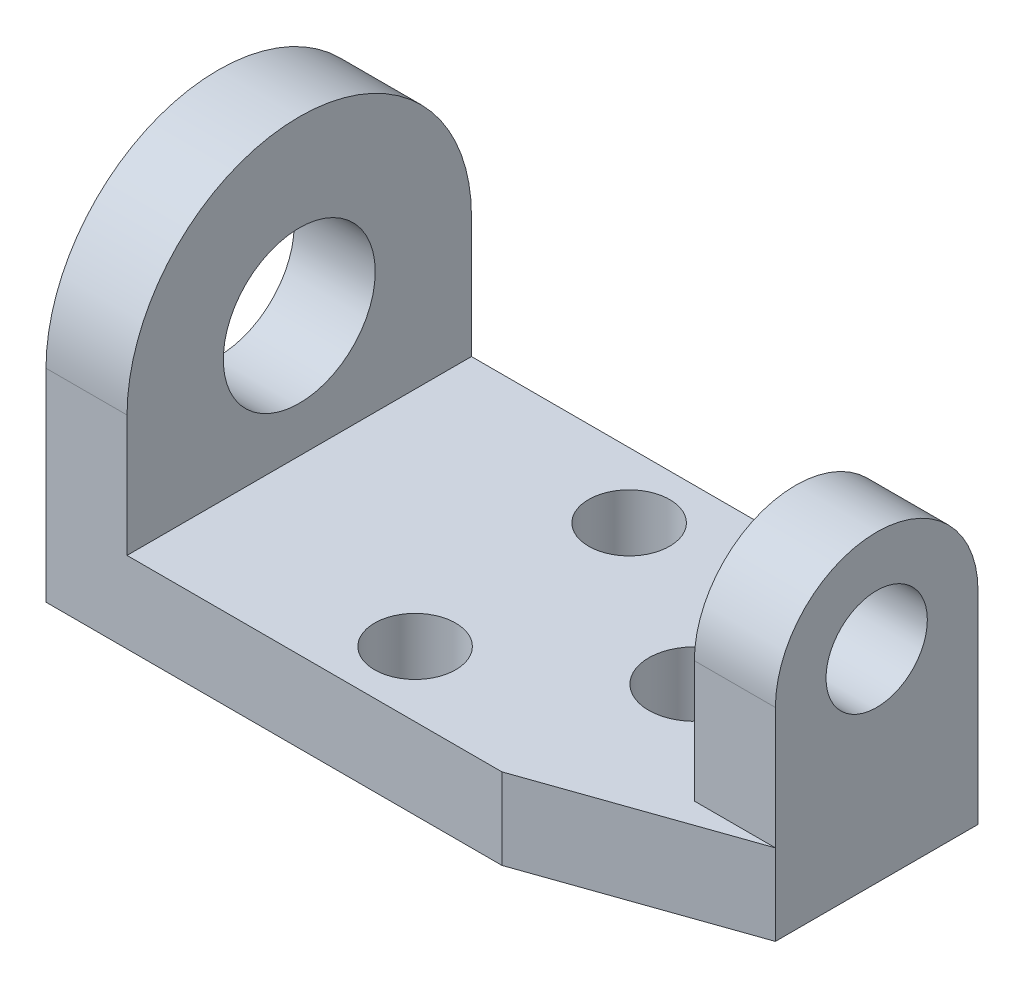
ISO-10303-21;
HEADER;
FILE_DESCRIPTION(('STEP AP214'),'2;1');
FILE_NAME('part.step','',(''),(''),'','','');
FILE_SCHEMA(('AUTOMOTIVE_DESIGN { 1 0 10303 214 1 1 1 1 }'));
ENDSEC;
DATA;
#1=APPLICATION_CONTEXT('core data for automotive mechanical design processes');
#2=APPLICATION_PROTOCOL_DEFINITION('international standard','automotive_design',2000,#1);
#3=PRODUCT_CONTEXT('',#1,'mechanical');
#4=PRODUCT('Part','Part','',(#3));
#5=PRODUCT_RELATED_PRODUCT_CATEGORY('part','',(#4));
#6=PRODUCT_DEFINITION_FORMATION('','',#4);
#7=PRODUCT_DEFINITION_CONTEXT('part definition',#1,'design');
#8=PRODUCT_DEFINITION('design','',#6,#7);
#9=PRODUCT_DEFINITION_SHAPE('','',#8);
#10=(LENGTH_UNIT() NAMED_UNIT(*) SI_UNIT(.MILLI.,.METRE.));
#11=(NAMED_UNIT(*) PLANE_ANGLE_UNIT() SI_UNIT($,.RADIAN.));
#12=(NAMED_UNIT(*) SI_UNIT($,.STERADIAN.) SOLID_ANGLE_UNIT());
#13=UNCERTAINTY_MEASURE_WITH_UNIT(LENGTH_MEASURE(1.E-05),#10,'distance_accuracy_value','');
#14=(GEOMETRIC_REPRESENTATION_CONTEXT(3) GLOBAL_UNCERTAINTY_ASSIGNED_CONTEXT((#13)) GLOBAL_UNIT_ASSIGNED_CONTEXT((#10,
#11,#12)) REPRESENTATION_CONTEXT('',''));
#15=CARTESIAN_POINT('',(0.,0.,0.));
#16=DIRECTION('',(0.,0.,1.));
#17=DIRECTION('',(1.,0.,0.));
#18=AXIS2_PLACEMENT_3D('',#15,#16,#17);
#19=CARTESIAN_POINT('',(0.,8.,0.));
#20=DIRECTION('',(-1.,0.,0.));
#21=DIRECTION('',(0.,0.,1.));
#22=AXIS2_PLACEMENT_3D('',#19,#20,#21);
#23=PLANE('',#22);
#24=CARTESIAN_POINT('',(0.,20.,0.));
#25=DIRECTION('',(1.,0.,0.));
#26=DIRECTION('',(0.,0.,-1.));
#27=AXIS2_PLACEMENT_3D('',#24,#25,#26);
#28=CIRCLE('',#27,7.5);
#29=CARTESIAN_POINT('',(0.,20.,-7.5));
#30=VERTEX_POINT('',#29);
#31=EDGE_CURVE('E203',#30,#30,#28,.T.);
#32=ORIENTED_EDGE('',*,*,#31,.T.);
#33=EDGE_LOOP('',(#32));
#34=FACE_BOUND('',#33,.T.);
#35=CARTESIAN_POINT('',(0.,20.,0.));
#36=DIRECTION('',(1.,0.,0.));
#37=DIRECTION('',(0.,0.,-1.));
#38=AXIS2_PLACEMENT_3D('',#35,#36,#37);
#39=CIRCLE('',#38,17.);
#40=CARTESIAN_POINT('',(0.,20.,-17.));
#41=VERTEX_POINT('',#40);
#42=CARTESIAN_POINT('',(0.,20.,17.));
#43=VERTEX_POINT('',#42);
#44=EDGE_CURVE('E186',#41,#43,#39,.T.);
#45=ORIENTED_EDGE('',*,*,#44,.F.);
#46=DIRECTION('',(0.,-1.,0.));
#47=VECTOR('',#46,1.);
#48=CARTESIAN_POINT('',(0.,8.,-17.));
#49=LINE('',#48,#47);
#50=CARTESIAN_POINT('',(0.,0.,-17.));
#51=VERTEX_POINT('',#50);
#52=EDGE_CURVE('E190',#41,#51,#49,.T.);
#53=ORIENTED_EDGE('',*,*,#52,.T.);
#54=DIRECTION('',(0.,0.,-1.));
#55=VECTOR('',#54,1.);
#56=CARTESIAN_POINT('',(0.,0.,0.));
#57=LINE('',#56,#55);
#58=CARTESIAN_POINT('',(0.,0.,17.));
#59=VERTEX_POINT('',#58);
#60=EDGE_CURVE('E240',#59,#51,#57,.T.);
#61=ORIENTED_EDGE('',*,*,#60,.F.);
#62=DIRECTION('',(0.,-1.,0.));
#63=VECTOR('',#62,1.);
#64=CARTESIAN_POINT('',(0.,8.,17.));
#65=LINE('',#64,#63);
#66=EDGE_CURVE('E192',#43,#59,#65,.T.);
#67=ORIENTED_EDGE('',*,*,#66,.F.);
#68=EDGE_LOOP('',(#45,#53,#61,#67));
#69=FACE_BOUND('',#68,.T.);
#70=ADVANCED_FACE('F95',(#34,#69),#23,.T.);
#71=CARTESIAN_POINT('',(8.,37.,0.));
#72=DIRECTION('',(1.,0.,0.));
#73=DIRECTION('',(0.,0.,-1.));
#74=AXIS2_PLACEMENT_3D('',#71,#72,#73);
#75=PLANE('',#74);
#76=CARTESIAN_POINT('',(8.,20.,0.));
#77=DIRECTION('',(1.,0.,0.));
#78=DIRECTION('',(0.,0.,-1.));
#79=AXIS2_PLACEMENT_3D('',#76,#77,#78);
#80=CIRCLE('',#79,7.5);
#81=CARTESIAN_POINT('',(8.,20.,-7.5));
#82=VERTEX_POINT('',#81);
#83=EDGE_CURVE('E332',#82,#82,#80,.T.);
#84=ORIENTED_EDGE('',*,*,#83,.F.);
#85=EDGE_LOOP('',(#84));
#86=FACE_BOUND('',#85,.T.);
#87=DIRECTION('',(0.,-1.,0.));
#88=VECTOR('',#87,1.);
#89=CARTESIAN_POINT('',(8.,37.,-17.));
#90=LINE('',#89,#88);
#91=CARTESIAN_POINT('',(8.,20.,-17.));
#92=VERTEX_POINT('',#91);
#93=CARTESIAN_POINT('',(8.,8.,-17.));
#94=VERTEX_POINT('',#93);
#95=EDGE_CURVE('E111',#92,#94,#90,.T.);
#96=ORIENTED_EDGE('',*,*,#95,.F.);
#97=CARTESIAN_POINT('',(8.,20.,0.));
#98=DIRECTION('',(1.,0.,0.));
#99=DIRECTION('',(0.,0.,-1.));
#100=AXIS2_PLACEMENT_3D('',#97,#98,#99);
#101=CIRCLE('',#100,17.);
#102=CARTESIAN_POINT('',(8.,20.,17.));
#103=VERTEX_POINT('',#102);
#104=EDGE_CURVE('E197',#92,#103,#101,.T.);
#105=ORIENTED_EDGE('',*,*,#104,.T.);
#106=DIRECTION('',(0.,-1.,0.));
#107=VECTOR('',#106,1.);
#108=CARTESIAN_POINT('',(8.,37.,17.));
#109=LINE('',#108,#107);
#110=CARTESIAN_POINT('',(8.,8.,17.));
#111=VERTEX_POINT('',#110);
#112=EDGE_CURVE('E282',#103,#111,#109,.T.);
#113=ORIENTED_EDGE('',*,*,#112,.T.);
#114=DIRECTION('',(0.,0.,-1.));
#115=VECTOR('',#114,1.);
#116=CARTESIAN_POINT('',(8.,8.,0.));
#117=LINE('',#116,#115);
#118=EDGE_CURVE('E253',#111,#94,#117,.T.);
#119=ORIENTED_EDGE('',*,*,#118,.T.);
#120=EDGE_LOOP('',(#96,#105,#113,#119));
#121=FACE_BOUND('',#120,.T.);
#122=ADVANCED_FACE('F347',(#86,#121),#75,.T.);
#123=CARTESIAN_POINT('',(0.,8.,-17.));
#124=DIRECTION('',(0.,0.,-1.));
#125=DIRECTION('',(-1.,0.,0.));
#126=AXIS2_PLACEMENT_3D('',#123,#124,#125);
#127=PLANE('',#126);
#128=ORIENTED_EDGE('',*,*,#52,.F.);
#129=DIRECTION('',(1.,0.,0.));
#130=VECTOR('',#129,1.);
#131=CARTESIAN_POINT('',(0.,20.,-17.));
#132=LINE('',#131,#130);
#133=EDGE_CURVE('E199',#41,#92,#132,.T.);
#134=ORIENTED_EDGE('',*,*,#133,.T.);
#135=ORIENTED_EDGE('',*,*,#95,.T.);
#136=DIRECTION('',(1.,0.,0.));
#137=VECTOR('',#136,1.);
#138=CARTESIAN_POINT('',(0.,8.,-17.));
#139=LINE('',#138,#137);
#140=CARTESIAN_POINT('',(45.,8.,-17.));
#141=VERTEX_POINT('',#140);
#142=EDGE_CURVE('E147',#94,#141,#139,.T.);
#143=ORIENTED_EDGE('',*,*,#142,.T.);
#144=DIRECTION('',(0.,-1.,0.));
#145=VECTOR('',#144,1.);
#146=CARTESIAN_POINT('',(45.,8.,-17.));
#147=LINE('',#146,#145);
#148=CARTESIAN_POINT('',(45.,0.,-17.));
#149=VERTEX_POINT('',#148);
#150=EDGE_CURVE('E104',#141,#149,#147,.T.);
#151=ORIENTED_EDGE('',*,*,#150,.T.);
#152=DIRECTION('',(1.,0.,0.));
#153=VECTOR('',#152,1.);
#154=CARTESIAN_POINT('',(0.,0.,-17.));
#155=LINE('',#154,#153);
#156=EDGE_CURVE('E206',#51,#149,#155,.T.);
#157=ORIENTED_EDGE('',*,*,#156,.F.);
#158=EDGE_LOOP('',(#128,#134,#135,#143,#151,#157));
#159=FACE_BOUND('',#158,.T.);
#160=ADVANCED_FACE('F205',(#159),#127,.T.);
#161=CARTESIAN_POINT('',(0.,8.,17.));
#162=DIRECTION('',(0.,0.,-1.));
#163=DIRECTION('',(-1.,0.,0.));
#164=AXIS2_PLACEMENT_3D('',#161,#162,#163);
#165=PLANE('',#164);
#166=DIRECTION('',(1.,0.,0.));
#167=VECTOR('',#166,1.);
#168=CARTESIAN_POINT('',(0.,20.,17.));
#169=LINE('',#168,#167);
#170=EDGE_CURVE('E196',#43,#103,#169,.T.);
#171=ORIENTED_EDGE('',*,*,#170,.F.);
#172=ORIENTED_EDGE('',*,*,#66,.T.);
#173=DIRECTION('',(1.,0.,0.));
#174=VECTOR('',#173,1.);
#175=CARTESIAN_POINT('',(0.,0.,17.));
#176=LINE('',#175,#174);
#177=CARTESIAN_POINT('',(45.,0.,17.));
#178=VERTEX_POINT('',#177);
#179=EDGE_CURVE('E237',#59,#178,#176,.T.);
#180=ORIENTED_EDGE('',*,*,#179,.T.);
#181=DIRECTION('',(0.,-1.,0.));
#182=VECTOR('',#181,1.);
#183=CARTESIAN_POINT('',(45.,8.,17.));
#184=LINE('',#183,#182);
#185=CARTESIAN_POINT('',(45.,8.,17.));
#186=VERTEX_POINT('',#185);
#187=EDGE_CURVE('E212',#186,#178,#184,.T.);
#188=ORIENTED_EDGE('',*,*,#187,.F.);
#189=DIRECTION('',(1.,0.,0.));
#190=VECTOR('',#189,1.);
#191=CARTESIAN_POINT('',(0.,8.,17.));
#192=LINE('',#191,#190);
#193=EDGE_CURVE('E269',#111,#186,#192,.T.);
#194=ORIENTED_EDGE('',*,*,#193,.F.);
#195=ORIENTED_EDGE('',*,*,#112,.F.);
#196=EDGE_LOOP('',(#171,#172,#180,#188,#194,#195));
#197=FACE_BOUND('',#196,.T.);
#198=ADVANCED_FACE('F369',(#197),#165,.F.);
#199=CARTESIAN_POINT('',(65.,8.,0.));
#200=DIRECTION('',(1.,0.,0.));
#201=DIRECTION('',(0.,0.,-1.));
#202=AXIS2_PLACEMENT_3D('',#199,#200,#201);
#203=PLANE('',#202);
#204=CARTESIAN_POINT('',(65.,20.,0.));
#205=DIRECTION('',(1.,0.,0.));
#206=DIRECTION('',(0.,0.,-1.));
#207=AXIS2_PLACEMENT_3D('',#204,#205,#206);
#208=CIRCLE('',#207,5.);
#209=CARTESIAN_POINT('',(65.,20.,-5.));
#210=VERTEX_POINT('',#209);
#211=EDGE_CURVE('E324',#210,#210,#208,.T.);
#212=ORIENTED_EDGE('',*,*,#211,.F.);
#213=EDGE_LOOP('',(#212));
#214=FACE_BOUND('',#213,.T.);
#215=DIRECTION('',(0.,-1.,0.));
#216=VECTOR('',#215,1.);
#217=CARTESIAN_POINT('',(65.,30.,-10.));
#218=LINE('',#217,#216);
#219=CARTESIAN_POINT('',(65.,20.,-10.));
#220=VERTEX_POINT('',#219);
#221=CARTESIAN_POINT('',(65.,8.,-10.));
#222=VERTEX_POINT('',#221);
#223=EDGE_CURVE('E304',#220,#222,#218,.T.);
#224=ORIENTED_EDGE('',*,*,#223,.F.);
#225=CARTESIAN_POINT('',(65.,20.,0.));
#226=DIRECTION('',(1.,0.,0.));
#227=DIRECTION('',(0.,0.,-1.));
#228=AXIS2_PLACEMENT_3D('',#225,#226,#227);
#229=CIRCLE('',#228,10.);
#230=CARTESIAN_POINT('',(65.,20.,10.));
#231=VERTEX_POINT('',#230);
#232=EDGE_CURVE('E311',#220,#231,#229,.T.);
#233=ORIENTED_EDGE('',*,*,#232,.T.);
#234=DIRECTION('',(0.,-1.,0.));
#235=VECTOR('',#234,1.);
#236=CARTESIAN_POINT('',(65.,30.,10.));
#237=LINE('',#236,#235);
#238=CARTESIAN_POINT('',(65.,8.,10.));
#239=VERTEX_POINT('',#238);
#240=EDGE_CURVE('E120',#231,#239,#237,.T.);
#241=ORIENTED_EDGE('',*,*,#240,.T.);
#242=DIRECTION('',(0.,-1.,0.));
#243=VECTOR('',#242,1.);
#244=CARTESIAN_POINT('',(65.,8.,10.));
#245=LINE('',#244,#243);
#246=CARTESIAN_POINT('',(65.,0.,10.));
#247=VERTEX_POINT('',#246);
#248=EDGE_CURVE('E144',#239,#247,#245,.T.);
#249=ORIENTED_EDGE('',*,*,#248,.T.);
#250=DIRECTION('',(0.,0.,1.));
#251=VECTOR('',#250,1.);
#252=CARTESIAN_POINT('',(65.,0.,0.));
#253=LINE('',#252,#251);
#254=CARTESIAN_POINT('',(65.,0.,-10.));
#255=VERTEX_POINT('',#254);
#256=EDGE_CURVE('E249',#255,#247,#253,.T.);
#257=ORIENTED_EDGE('',*,*,#256,.F.);
#258=DIRECTION('',(0.,-1.,0.));
#259=VECTOR('',#258,1.);
#260=CARTESIAN_POINT('',(65.,8.,-10.));
#261=LINE('',#260,#259);
#262=EDGE_CURVE('E12',#222,#255,#261,.T.);
#263=ORIENTED_EDGE('',*,*,#262,.F.);
#264=EDGE_LOOP('',(#224,#233,#241,#249,#257,#263));
#265=FACE_BOUND('',#264,.T.);
#266=ADVANCED_FACE('F97',(#214,#265),#203,.T.);
#267=CARTESIAN_POINT('',(57.,30.,0.));
#268=DIRECTION('',(1.,0.,0.));
#269=DIRECTION('',(0.,0.,-1.));
#270=AXIS2_PLACEMENT_3D('',#267,#268,#269);
#271=PLANE('',#270);
#272=CARTESIAN_POINT('',(57.,20.,0.));
#273=DIRECTION('',(1.,0.,0.));
#274=DIRECTION('',(0.,0.,-1.));
#275=AXIS2_PLACEMENT_3D('',#272,#273,#274);
#276=CIRCLE('',#275,5.);
#277=CARTESIAN_POINT('',(57.,20.,-5.));
#278=VERTEX_POINT('',#277);
#279=EDGE_CURVE('E320',#278,#278,#276,.F.);
#280=ORIENTED_EDGE('',*,*,#279,.F.);
#281=EDGE_LOOP('',(#280));
#282=FACE_BOUND('',#281,.T.);
#283=CARTESIAN_POINT('',(57.,20.,0.));
#284=DIRECTION('',(1.,0.,0.));
#285=DIRECTION('',(0.,0.,-1.));
#286=AXIS2_PLACEMENT_3D('',#283,#284,#285);
#287=CIRCLE('',#286,10.);
#288=CARTESIAN_POINT('',(57.,20.,10.));
#289=VERTEX_POINT('',#288);
#290=CARTESIAN_POINT('',(57.,20.,-10.));
#291=VERTEX_POINT('',#290);
#292=EDGE_CURVE('E307',#289,#291,#287,.F.);
#293=ORIENTED_EDGE('',*,*,#292,.T.);
#294=DIRECTION('',(0.,-1.,0.));
#295=VECTOR('',#294,1.);
#296=CARTESIAN_POINT('',(57.,30.,-10.));
#297=LINE('',#296,#295);
#298=CARTESIAN_POINT('',(57.,8.,-10.));
#299=VERTEX_POINT('',#298);
#300=EDGE_CURVE('E296',#291,#299,#297,.T.);
#301=ORIENTED_EDGE('',*,*,#300,.T.);
#302=DIRECTION('',(0.,0.,-1.));
#303=VECTOR('',#302,1.);
#304=CARTESIAN_POINT('',(57.,8.,0.));
#305=LINE('',#304,#303);
#306=CARTESIAN_POINT('',(57.,8.,10.));
#307=VERTEX_POINT('',#306);
#308=EDGE_CURVE('E289',#307,#299,#305,.T.);
#309=ORIENTED_EDGE('',*,*,#308,.F.);
#310=DIRECTION('',(0.,-1.,0.));
#311=VECTOR('',#310,1.);
#312=CARTESIAN_POINT('',(57.,30.,10.));
#313=LINE('',#312,#311);
#314=EDGE_CURVE('E299',#289,#307,#313,.T.);
#315=ORIENTED_EDGE('',*,*,#314,.F.);
#316=EDGE_LOOP('',(#293,#301,#309,#315));
#317=FACE_BOUND('',#316,.T.);
#318=ADVANCED_FACE('F380',(#282,#317),#271,.F.);
#319=CARTESIAN_POINT('',(0.,8.,0.));
#320=DIRECTION('',(0.,1.,0.));
#321=DIRECTION('',(0.,0.,1.));
#322=AXIS2_PLACEMENT_3D('',#319,#320,#321);
#323=PLANE('',#322);
#324=CARTESIAN_POINT('',(47.,8.,0.));
#325=DIRECTION('',(0.,1.,0.));
#326=DIRECTION('',(0.,0.,1.));
#327=AXIS2_PLACEMENT_3D('',#324,#325,#326);
#328=CIRCLE('',#327,4.5);
#329=CARTESIAN_POINT('',(47.,8.,4.5));
#330=VERTEX_POINT('',#329);
#331=EDGE_CURVE('E261',#330,#330,#328,.T.);
#332=ORIENTED_EDGE('',*,*,#331,.F.);
#333=EDGE_LOOP('',(#332));
#334=FACE_BOUND('',#333,.T.);
#335=CARTESIAN_POINT('',(30.,8.,-10.5630200663708));
#336=DIRECTION('',(0.,1.,0.));
#337=DIRECTION('',(0.,0.,1.));
#338=AXIS2_PLACEMENT_3D('',#335,#336,#337);
#339=CIRCLE('',#338,4.);
#340=CARTESIAN_POINT('',(30.,8.,-6.56302006637082));
#341=VERTEX_POINT('',#340);
#342=EDGE_CURVE('E257',#341,#341,#339,.T.);
#343=ORIENTED_EDGE('',*,*,#342,.F.);
#344=EDGE_LOOP('',(#343));
#345=FACE_BOUND('',#344,.T.);
#346=CARTESIAN_POINT('',(30.,8.,10.5630200663708));
#347=DIRECTION('',(0.,1.,0.));
#348=DIRECTION('',(0.,0.,1.));
#349=AXIS2_PLACEMENT_3D('',#346,#347,#348);
#350=CIRCLE('',#349,4.);
#351=CARTESIAN_POINT('',(30.,8.,14.5630200663708));
#352=VERTEX_POINT('',#351);
#353=EDGE_CURVE('E220',#352,#352,#350,.F.);
#354=ORIENTED_EDGE('',*,*,#353,.T.);
#355=EDGE_LOOP('',(#354));
#356=FACE_BOUND('',#355,.T.);
#357=ORIENTED_EDGE('',*,*,#308,.T.);
#358=DIRECTION('',(1.,0.,0.));
#359=VECTOR('',#358,1.);
#360=CARTESIAN_POINT('',(0.,8.,-10.));
#361=LINE('',#360,#359);
#362=EDGE_CURVE('E285',#299,#222,#361,.T.);
#363=ORIENTED_EDGE('',*,*,#362,.T.);
#364=DIRECTION('',(0.943858356366018,0.,0.330350424728106));
#365=VECTOR('',#364,1.);
#366=CARTESIAN_POINT('',(10.2115812917595,8.,-29.1759465478842));
#367=LINE('',#366,#365);
#368=EDGE_CURVE('E225',#141,#222,#367,.T.);
#369=ORIENTED_EDGE('',*,*,#368,.F.);
#370=ORIENTED_EDGE('',*,*,#142,.F.);
#371=ORIENTED_EDGE('',*,*,#118,.F.);
#372=ORIENTED_EDGE('',*,*,#193,.T.);
#373=DIRECTION('',(0.943858356366018,0.,-0.330350424728106));
#374=VECTOR('',#373,1.);
#375=CARTESIAN_POINT('',(10.2115812917595,8.,29.1759465478842));
#376=LINE('',#375,#374);
#377=EDGE_CURVE('E265',#186,#239,#376,.T.);
#378=ORIENTED_EDGE('',*,*,#377,.T.);
#379=DIRECTION('',(1.,0.,0.));
#380=VECTOR('',#379,1.);
#381=CARTESIAN_POINT('',(0.,8.,10.));
#382=LINE('',#381,#380);
#383=EDGE_CURVE('E293',#307,#239,#382,.T.);
#384=ORIENTED_EDGE('',*,*,#383,.F.);
#385=EDGE_LOOP('',(#357,#363,#369,#370,#371,#372,#378,#384));
#386=FACE_BOUND('',#385,.T.);
#387=ADVANCED_FACE('F355',(#334,#345,#356,#386),#323,.T.);
#388=CARTESIAN_POINT('',(10.2115812917595,8.,-29.1759465478842));
#389=DIRECTION('',(0.330350424728106,0.,-0.943858356366018));
#390=DIRECTION('',(-0.943858356366018,0.,-0.330350424728106));
#391=AXIS2_PLACEMENT_3D('',#388,#389,#390);
#392=PLANE('',#391);
#393=DIRECTION('',(0.943858356366018,0.,0.330350424728106));
#394=VECTOR('',#393,1.);
#395=CARTESIAN_POINT('',(10.2115812917595,0.,-29.1759465478842));
#396=LINE('',#395,#394);
#397=EDGE_CURVE('E245',#149,#255,#396,.T.);
#398=ORIENTED_EDGE('',*,*,#397,.F.);
#399=ORIENTED_EDGE('',*,*,#150,.F.);
#400=ORIENTED_EDGE('',*,*,#368,.T.);
#401=ORIENTED_EDGE('',*,*,#262,.T.);
#402=EDGE_LOOP('',(#398,#399,#400,#401));
#403=FACE_BOUND('',#402,.T.);
#404=ADVANCED_FACE('F362',(#403),#392,.T.);
#405=CARTESIAN_POINT('',(30.,8.,-10.5630200663708));
#406=DIRECTION('',(0.,-1.,0.));
#407=DIRECTION('',(0.,0.,-1.));
#408=AXIS2_PLACEMENT_3D('',#405,#406,#407);
#409=CYLINDRICAL_SURFACE('',#408,4.);
#410=ORIENTED_EDGE('',*,*,#342,.T.);
#411=EDGE_LOOP('',(#410));
#412=FACE_BOUND('',#411,.T.);
#413=CARTESIAN_POINT('',(30.,0.,-10.5630200663708));
#414=DIRECTION('',(0.,1.,0.));
#415=DIRECTION('',(0.,0.,1.));
#416=AXIS2_PLACEMENT_3D('',#413,#414,#415);
#417=CIRCLE('',#416,4.);
#418=CARTESIAN_POINT('',(30.,0.,-6.56302006637082));
#419=VERTEX_POINT('',#418);
#420=EDGE_CURVE('E226',#419,#419,#417,.T.);
#421=ORIENTED_EDGE('',*,*,#420,.F.);
#422=EDGE_LOOP('',(#421));
#423=FACE_BOUND('',#422,.T.);
#424=ADVANCED_FACE('F407',(#412,#423),#409,.F.);
#425=CARTESIAN_POINT('',(47.,8.,0.));
#426=DIRECTION('',(0.,-1.,0.));
#427=DIRECTION('',(0.,0.,-1.));
#428=AXIS2_PLACEMENT_3D('',#425,#426,#427);
#429=CYLINDRICAL_SURFACE('',#428,4.5);
#430=ORIENTED_EDGE('',*,*,#331,.T.);
#431=EDGE_LOOP('',(#430));
#432=FACE_BOUND('',#431,.T.);
#433=CARTESIAN_POINT('',(47.,0.,0.));
#434=DIRECTION('',(0.,1.,0.));
#435=DIRECTION('',(0.,0.,1.));
#436=AXIS2_PLACEMENT_3D('',#433,#434,#435);
#437=CIRCLE('',#436,4.5);
#438=CARTESIAN_POINT('',(47.,0.,4.5));
#439=VERTEX_POINT('',#438);
#440=EDGE_CURVE('E230',#439,#439,#437,.T.);
#441=ORIENTED_EDGE('',*,*,#440,.F.);
#442=EDGE_LOOP('',(#441));
#443=FACE_BOUND('',#442,.T.);
#444=ADVANCED_FACE('F413',(#432,#443),#429,.F.);
#445=CARTESIAN_POINT('',(10.2115812917595,8.,29.1759465478842));
#446=DIRECTION('',(-0.330350424728106,0.,-0.943858356366018));
#447=DIRECTION('',(-0.943858356366018,0.,0.330350424728106));
#448=AXIS2_PLACEMENT_3D('',#445,#446,#447);
#449=PLANE('',#448);
#450=DIRECTION('',(0.943858356366018,0.,-0.330350424728106));
#451=VECTOR('',#450,1.);
#452=CARTESIAN_POINT('',(10.2115812917595,0.,29.1759465478842));
#453=LINE('',#452,#451);
#454=EDGE_CURVE('E234',#178,#247,#453,.T.);
#455=ORIENTED_EDGE('',*,*,#454,.T.);
#456=ORIENTED_EDGE('',*,*,#248,.F.);
#457=ORIENTED_EDGE('',*,*,#377,.F.);
#458=ORIENTED_EDGE('',*,*,#187,.T.);
#459=EDGE_LOOP('',(#455,#456,#457,#458));
#460=FACE_BOUND('',#459,.T.);
#461=ADVANCED_FACE('F372',(#460),#449,.F.);
#462=CARTESIAN_POINT('',(30.,8.,10.5630200663708));
#463=DIRECTION('',(0.,-1.,0.));
#464=DIRECTION('',(0.,0.,-1.));
#465=AXIS2_PLACEMENT_3D('',#462,#463,#464);
#466=CYLINDRICAL_SURFACE('',#465,4.);
#467=ORIENTED_EDGE('',*,*,#353,.F.);
#468=EDGE_LOOP('',(#467));
#469=FACE_BOUND('',#468,.T.);
#470=CARTESIAN_POINT('',(30.,0.,10.5630200663708));
#471=DIRECTION('',(0.,1.,0.));
#472=DIRECTION('',(0.,0.,1.));
#473=AXIS2_PLACEMENT_3D('',#470,#471,#472);
#474=CIRCLE('',#473,4.);
#475=CARTESIAN_POINT('',(30.,0.,14.5630200663708));
#476=VERTEX_POINT('',#475);
#477=EDGE_CURVE('E221',#476,#476,#474,.F.);
#478=ORIENTED_EDGE('',*,*,#477,.T.);
#479=EDGE_LOOP('',(#478));
#480=FACE_BOUND('',#479,.T.);
#481=ADVANCED_FACE('F430',(#469,#480),#466,.F.);
#482=CARTESIAN_POINT('',(0.,0.,0.));
#483=DIRECTION('',(0.,1.,0.));
#484=DIRECTION('',(0.,0.,1.));
#485=AXIS2_PLACEMENT_3D('',#482,#483,#484);
#486=PLANE('',#485);
#487=ORIENTED_EDGE('',*,*,#397,.T.);
#488=ORIENTED_EDGE('',*,*,#256,.T.);
#489=ORIENTED_EDGE('',*,*,#454,.F.);
#490=ORIENTED_EDGE('',*,*,#179,.F.);
#491=ORIENTED_EDGE('',*,*,#60,.T.);
#492=ORIENTED_EDGE('',*,*,#156,.T.);
#493=EDGE_LOOP('',(#487,#488,#489,#490,#491,#492));
#494=FACE_BOUND('',#493,.T.);
#495=ORIENTED_EDGE('',*,*,#477,.F.);
#496=EDGE_LOOP('',(#495));
#497=FACE_BOUND('',#496,.T.);
#498=ORIENTED_EDGE('',*,*,#420,.T.);
#499=EDGE_LOOP('',(#498));
#500=FACE_BOUND('',#499,.T.);
#501=ORIENTED_EDGE('',*,*,#440,.T.);
#502=EDGE_LOOP('',(#501));
#503=FACE_BOUND('',#502,.T.);
#504=ADVANCED_FACE('F364',(#494,#497,#500,#503),#486,.F.);
#505=CARTESIAN_POINT('',(0.,30.,-10.));
#506=DIRECTION('',(0.,0.,1.));
#507=DIRECTION('',(1.,0.,0.));
#508=AXIS2_PLACEMENT_3D('',#505,#506,#507);
#509=PLANE('',#508);
#510=ORIENTED_EDGE('',*,*,#300,.F.);
#511=DIRECTION('',(1.,0.,0.));
#512=VECTOR('',#511,1.);
#513=CARTESIAN_POINT('',(42.857864376269,20.,-10.));
#514=LINE('',#513,#512);
#515=EDGE_CURVE('E314',#291,#220,#514,.T.);
#516=ORIENTED_EDGE('',*,*,#515,.T.);
#517=ORIENTED_EDGE('',*,*,#223,.T.);
#518=ORIENTED_EDGE('',*,*,#362,.F.);
#519=EDGE_LOOP('',(#510,#516,#517,#518));
#520=FACE_BOUND('',#519,.T.);
#521=ADVANCED_FACE('F384',(#520),#509,.F.);
#522=CARTESIAN_POINT('',(0.,30.,10.));
#523=DIRECTION('',(0.,0.,1.));
#524=DIRECTION('',(1.,0.,0.));
#525=AXIS2_PLACEMENT_3D('',#522,#523,#524);
#526=PLANE('',#525);
#527=DIRECTION('',(1.,0.,0.));
#528=VECTOR('',#527,1.);
#529=CARTESIAN_POINT('',(42.857864376269,20.,10.));
#530=LINE('',#529,#528);
#531=EDGE_CURVE('E308',#289,#231,#530,.T.);
#532=ORIENTED_EDGE('',*,*,#531,.F.);
#533=ORIENTED_EDGE('',*,*,#314,.T.);
#534=ORIENTED_EDGE('',*,*,#383,.T.);
#535=ORIENTED_EDGE('',*,*,#240,.F.);
#536=EDGE_LOOP('',(#532,#533,#534,#535));
#537=FACE_BOUND('',#536,.T.);
#538=ADVANCED_FACE('F377',(#537),#526,.T.);
#539=CARTESIAN_POINT('',(42.857864376269,20.,0.));
#540=DIRECTION('',(1.,0.,0.));
#541=DIRECTION('',(0.,0.,-1.));
#542=AXIS2_PLACEMENT_3D('',#539,#540,#541);
#543=CYLINDRICAL_SURFACE('',#542,10.);
#544=ORIENTED_EDGE('',*,*,#531,.T.);
#545=ORIENTED_EDGE('',*,*,#232,.F.);
#546=ORIENTED_EDGE('',*,*,#515,.F.);
#547=ORIENTED_EDGE('',*,*,#292,.F.);
#548=EDGE_LOOP('',(#544,#545,#546,#547));
#549=FACE_BOUND('',#548,.T.);
#550=ADVANCED_FACE('F387',(#549),#543,.T.);
#551=CARTESIAN_POINT('',(42.857864376269,20.,0.));
#552=DIRECTION('',(1.,0.,0.));
#553=DIRECTION('',(0.,0.,-1.));
#554=AXIS2_PLACEMENT_3D('',#551,#552,#553);
#555=CYLINDRICAL_SURFACE('',#554,5.);
#556=ORIENTED_EDGE('',*,*,#279,.T.);
#557=EDGE_LOOP('',(#556));
#558=FACE_BOUND('',#557,.T.);
#559=ORIENTED_EDGE('',*,*,#211,.T.);
#560=EDGE_LOOP('',(#559));
#561=FACE_BOUND('',#560,.T.);
#562=ADVANCED_FACE('F389',(#558,#561),#555,.F.);
#563=CARTESIAN_POINT('',(0.,20.,0.));
#564=DIRECTION('',(1.,0.,0.));
#565=DIRECTION('',(0.,0.,-1.));
#566=AXIS2_PLACEMENT_3D('',#563,#564,#565);
#567=CYLINDRICAL_SURFACE('',#566,17.);
#568=ORIENTED_EDGE('',*,*,#104,.F.);
#569=ORIENTED_EDGE('',*,*,#133,.F.);
#570=ORIENTED_EDGE('',*,*,#44,.T.);
#571=ORIENTED_EDGE('',*,*,#170,.T.);
#572=EDGE_LOOP('',(#568,#569,#570,#571));
#573=FACE_BOUND('',#572,.T.);
#574=ADVANCED_FACE('F200',(#573),#567,.T.);
#575=CARTESIAN_POINT('',(0.,20.,0.));
#576=DIRECTION('',(1.,0.,0.));
#577=DIRECTION('',(0.,0.,-1.));
#578=AXIS2_PLACEMENT_3D('',#575,#576,#577);
#579=CYLINDRICAL_SURFACE('',#578,7.5);
#580=ORIENTED_EDGE('',*,*,#31,.F.);
#581=EDGE_LOOP('',(#580));
#582=FACE_BOUND('',#581,.T.);
#583=ORIENTED_EDGE('',*,*,#83,.T.);
#584=EDGE_LOOP('',(#583));
#585=FACE_BOUND('',#584,.T.);
#586=ADVANCED_FACE('F341',(#582,#585),#579,.F.);
#587=CLOSED_SHELL('',(#70,#122,#160,#198,#266,#318,#387,#404,#424,#444,#461,#481,#504,#521,#538,
#550,#562,#574,#586));
#588=MANIFOLD_SOLID_BREP('B2',#587);
#589=ADVANCED_BREP_SHAPE_REPRESENTATION('',(#18,#588),#14);
#590=SHAPE_DEFINITION_REPRESENTATION(#9,#589);
ENDSEC;
END-ISO-10303-21;
